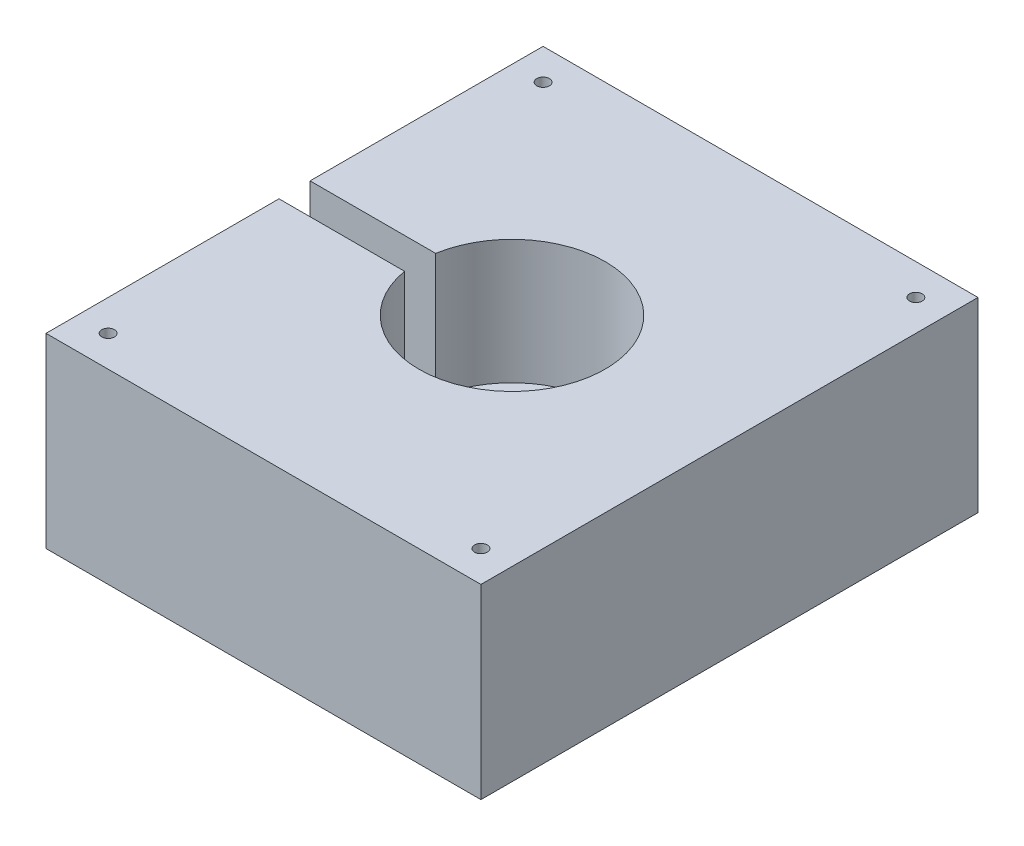
ISO-10303-21;
HEADER;
FILE_DESCRIPTION(('STEP AP214'),'2;1');
FILE_NAME('part.step','',(''),(''),'','','');
FILE_SCHEMA(('AUTOMOTIVE_DESIGN { 1 0 10303 214 1 1 1 1 }'));
ENDSEC;
DATA;
#1=APPLICATION_CONTEXT('core data for automotive mechanical design processes');
#2=APPLICATION_PROTOCOL_DEFINITION('international standard','automotive_design',2000,#1);
#3=PRODUCT_CONTEXT('',#1,'mechanical');
#4=PRODUCT('Part','Part','',(#3));
#5=PRODUCT_RELATED_PRODUCT_CATEGORY('part','',(#4));
#6=PRODUCT_DEFINITION_FORMATION('','',#4);
#7=PRODUCT_DEFINITION_CONTEXT('part definition',#1,'design');
#8=PRODUCT_DEFINITION('design','',#6,#7);
#9=PRODUCT_DEFINITION_SHAPE('','',#8);
#10=(LENGTH_UNIT() NAMED_UNIT(*) SI_UNIT(.MILLI.,.METRE.));
#11=(NAMED_UNIT(*) PLANE_ANGLE_UNIT() SI_UNIT($,.RADIAN.));
#12=(NAMED_UNIT(*) SI_UNIT($,.STERADIAN.) SOLID_ANGLE_UNIT());
#13=UNCERTAINTY_MEASURE_WITH_UNIT(LENGTH_MEASURE(1.E-05),#10,'distance_accuracy_value','');
#14=(GEOMETRIC_REPRESENTATION_CONTEXT(3) GLOBAL_UNCERTAINTY_ASSIGNED_CONTEXT((#13)) GLOBAL_UNIT_ASSIGNED_CONTEXT((#10,
#11,#12)) REPRESENTATION_CONTEXT('',''));
#15=CARTESIAN_POINT('',(0.,0.,0.));
#16=DIRECTION('',(0.,0.,1.));
#17=DIRECTION('',(1.,0.,0.));
#18=AXIS2_PLACEMENT_3D('',#15,#16,#17);
#19=CARTESIAN_POINT('',(88.9,76.2,101.6));
#20=DIRECTION('',(-1.,0.,0.));
#21=DIRECTION('',(0.,0.,1.));
#22=AXIS2_PLACEMENT_3D('',#19,#20,#21);
#23=PLANE('',#22);
#24=DIRECTION('',(0.,0.,-1.));
#25=VECTOR('',#24,1.);
#26=CARTESIAN_POINT('',(88.9,0.,101.6));
#27=LINE('',#26,#25);
#28=CARTESIAN_POINT('',(88.9,0.,101.6));
#29=VERTEX_POINT('',#28);
#30=CARTESIAN_POINT('',(88.9,0.,-101.6));
#31=VERTEX_POINT('',#30);
#32=EDGE_CURVE('E184',#29,#31,#27,.T.);
#33=ORIENTED_EDGE('',*,*,#32,.T.);
#34=DIRECTION('',(0.,-1.,0.));
#35=VECTOR('',#34,1.);
#36=CARTESIAN_POINT('',(88.9,76.2,-101.6));
#37=LINE('',#36,#35);
#38=CARTESIAN_POINT('',(88.9,76.2,-101.6));
#39=VERTEX_POINT('',#38);
#40=EDGE_CURVE('E11',#39,#31,#37,.T.);
#41=ORIENTED_EDGE('',*,*,#40,.F.);
#42=DIRECTION('',(0.,0.,-1.));
#43=VECTOR('',#42,1.);
#44=CARTESIAN_POINT('',(88.9,76.2,101.6));
#45=LINE('',#44,#43);
#46=CARTESIAN_POINT('',(88.9,76.2,101.6));
#47=VERTEX_POINT('',#46);
#48=EDGE_CURVE('E185',#47,#39,#45,.T.);
#49=ORIENTED_EDGE('',*,*,#48,.F.);
#50=DIRECTION('',(0.,-1.,0.));
#51=VECTOR('',#50,1.);
#52=CARTESIAN_POINT('',(88.9,76.2,101.6));
#53=LINE('',#52,#51);
#54=EDGE_CURVE('E192',#47,#29,#53,.T.);
#55=ORIENTED_EDGE('',*,*,#54,.T.);
#56=EDGE_LOOP('',(#33,#41,#49,#55));
#57=FACE_BOUND('',#56,.T.);
#58=ADVANCED_FACE('F41',(#57),#23,.F.);
#59=CARTESIAN_POINT('',(-88.9,76.2,-101.6));
#60=DIRECTION('',(0.,0.,1.));
#61=DIRECTION('',(1.,0.,0.));
#62=AXIS2_PLACEMENT_3D('',#59,#60,#61);
#63=PLANE('',#62);
#64=DIRECTION('',(-1.,0.,0.));
#65=VECTOR('',#64,1.);
#66=CARTESIAN_POINT('',(-88.9,0.,-101.6));
#67=LINE('',#66,#65);
#68=CARTESIAN_POINT('',(-88.9,0.,-101.6));
#69=VERTEX_POINT('',#68);
#70=EDGE_CURVE('E195',#31,#69,#67,.T.);
#71=ORIENTED_EDGE('',*,*,#70,.T.);
#72=DIRECTION('',(0.,-1.,0.));
#73=VECTOR('',#72,1.);
#74=CARTESIAN_POINT('',(-88.9,76.2,-101.6));
#75=LINE('',#74,#73);
#76=CARTESIAN_POINT('',(-88.9,76.2,-101.6));
#77=VERTEX_POINT('',#76);
#78=EDGE_CURVE('E48',#77,#69,#75,.T.);
#79=ORIENTED_EDGE('',*,*,#78,.F.);
#80=DIRECTION('',(-1.,0.,0.));
#81=VECTOR('',#80,1.);
#82=CARTESIAN_POINT('',(-88.9,76.2,-101.6));
#83=LINE('',#82,#81);
#84=EDGE_CURVE('E92',#39,#77,#83,.T.);
#85=ORIENTED_EDGE('',*,*,#84,.F.);
#86=ORIENTED_EDGE('',*,*,#40,.T.);
#87=EDGE_LOOP('',(#71,#79,#85,#86));
#88=FACE_BOUND('',#87,.T.);
#89=ADVANCED_FACE('F229',(#88),#63,.F.);
#90=CARTESIAN_POINT('',(-88.9,76.2,101.6));
#91=DIRECTION('',(1.,0.,0.));
#92=DIRECTION('',(0.,0.,-1.));
#93=AXIS2_PLACEMENT_3D('',#90,#91,#92);
#94=PLANE('',#93);
#95=DIRECTION('',(0.,0.,1.));
#96=VECTOR('',#95,1.);
#97=CARTESIAN_POINT('',(-88.9,25.4,0.));
#98=LINE('',#97,#96);
#99=CARTESIAN_POINT('',(-88.9,25.4,-6.35));
#100=VERTEX_POINT('',#99);
#101=CARTESIAN_POINT('',(-88.9,25.4,6.35));
#102=VERTEX_POINT('',#101);
#103=EDGE_CURVE('E137',#100,#102,#98,.T.);
#104=ORIENTED_EDGE('',*,*,#103,.F.);
#105=DIRECTION('',(0.,1.,0.));
#106=VECTOR('',#105,1.);
#107=CARTESIAN_POINT('',(-88.9,-122.706178129071,-6.35));
#108=LINE('',#107,#106);
#109=CARTESIAN_POINT('',(-88.9,76.2,-6.35));
#110=VERTEX_POINT('',#109);
#111=EDGE_CURVE('E126',#100,#110,#108,.T.);
#112=ORIENTED_EDGE('',*,*,#111,.T.);
#113=DIRECTION('',(0.,0.,1.));
#114=VECTOR('',#113,1.);
#115=CARTESIAN_POINT('',(-88.9,76.2,101.6));
#116=LINE('',#115,#114);
#117=EDGE_CURVE('E189',#77,#110,#116,.T.);
#118=ORIENTED_EDGE('',*,*,#117,.F.);
#119=ORIENTED_EDGE('',*,*,#78,.T.);
#120=DIRECTION('',(0.,0.,1.));
#121=VECTOR('',#120,1.);
#122=CARTESIAN_POINT('',(-88.9,0.,101.6));
#123=LINE('',#122,#121);
#124=CARTESIAN_POINT('',(-88.9,0.,101.6));
#125=VERTEX_POINT('',#124);
#126=EDGE_CURVE('E197',#69,#125,#123,.T.);
#127=ORIENTED_EDGE('',*,*,#126,.T.);
#128=DIRECTION('',(0.,-1.,0.));
#129=VECTOR('',#128,1.);
#130=CARTESIAN_POINT('',(-88.9,76.2,101.6));
#131=LINE('',#130,#129);
#132=CARTESIAN_POINT('',(-88.9,76.2,101.6));
#133=VERTEX_POINT('',#132);
#134=EDGE_CURVE('E201',#133,#125,#131,.T.);
#135=ORIENTED_EDGE('',*,*,#134,.F.);
#136=CARTESIAN_POINT('',(-88.9,76.2,6.35));
#137=VERTEX_POINT('',#136);
#138=EDGE_CURVE('E188',#137,#133,#116,.T.);
#139=ORIENTED_EDGE('',*,*,#138,.F.);
#140=DIRECTION('',(0.,1.,0.));
#141=VECTOR('',#140,1.);
#142=CARTESIAN_POINT('',(-88.9,-122.706178129071,6.35));
#143=LINE('',#142,#141);
#144=EDGE_CURVE('E149',#102,#137,#143,.T.);
#145=ORIENTED_EDGE('',*,*,#144,.F.);
#146=EDGE_LOOP('',(#104,#112,#118,#119,#127,#135,#139,#145));
#147=FACE_BOUND('',#146,.T.);
#148=ADVANCED_FACE('F147',(#147),#94,.F.);
#149=CARTESIAN_POINT('',(-88.9,76.2,101.6));
#150=DIRECTION('',(0.,0.,-1.));
#151=DIRECTION('',(-1.,0.,0.));
#152=AXIS2_PLACEMENT_3D('',#149,#150,#151);
#153=PLANE('',#152);
#154=DIRECTION('',(1.,0.,0.));
#155=VECTOR('',#154,1.);
#156=CARTESIAN_POINT('',(-88.9,0.,101.6));
#157=LINE('',#156,#155);
#158=EDGE_CURVE('E85',#125,#29,#157,.T.);
#159=ORIENTED_EDGE('',*,*,#158,.T.);
#160=ORIENTED_EDGE('',*,*,#54,.F.);
#161=DIRECTION('',(1.,0.,0.));
#162=VECTOR('',#161,1.);
#163=CARTESIAN_POINT('',(-88.9,76.2,101.6));
#164=LINE('',#163,#162);
#165=EDGE_CURVE('E64',#133,#47,#164,.T.);
#166=ORIENTED_EDGE('',*,*,#165,.F.);
#167=ORIENTED_EDGE('',*,*,#134,.T.);
#168=EDGE_LOOP('',(#159,#160,#166,#167));
#169=FACE_BOUND('',#168,.T.);
#170=ADVANCED_FACE('F211',(#169),#153,.F.);
#171=CARTESIAN_POINT('',(0.,76.2,0.));
#172=DIRECTION('',(0.,-1.,0.));
#173=DIRECTION('',(0.,0.,-1.));
#174=AXIS2_PLACEMENT_3D('',#171,#172,#173);
#175=PLANE('',#174);
#176=CARTESIAN_POINT('',(76.2,76.2,-88.9));
#177=DIRECTION('',(0.,1.,0.));
#178=DIRECTION('',(0.,0.,1.));
#179=AXIS2_PLACEMENT_3D('',#176,#177,#178);
#180=CIRCLE('',#179,2.5908);
#181=CARTESIAN_POINT('',(76.2,76.2,-86.3092));
#182=VERTEX_POINT('',#181);
#183=EDGE_CURVE('E160',#182,#182,#180,.T.);
#184=ORIENTED_EDGE('',*,*,#183,.F.);
#185=EDGE_LOOP('',(#184));
#186=FACE_BOUND('',#185,.T.);
#187=CARTESIAN_POINT('',(76.2,76.2,88.9));
#188=DIRECTION('',(0.,1.,0.));
#189=DIRECTION('',(0.,0.,1.));
#190=AXIS2_PLACEMENT_3D('',#187,#188,#189);
#191=CIRCLE('',#190,2.5908);
#192=CARTESIAN_POINT('',(76.2,76.2,91.4908));
#193=VERTEX_POINT('',#192);
#194=EDGE_CURVE('E166',#193,#193,#191,.T.);
#195=ORIENTED_EDGE('',*,*,#194,.F.);
#196=EDGE_LOOP('',(#195));
#197=FACE_BOUND('',#196,.T.);
#198=CARTESIAN_POINT('',(-76.2,76.2,88.9));
#199=DIRECTION('',(0.,1.,0.));
#200=DIRECTION('',(0.,0.,1.));
#201=AXIS2_PLACEMENT_3D('',#198,#199,#200);
#202=CIRCLE('',#201,2.5908);
#203=CARTESIAN_POINT('',(-76.2,76.2,91.4908));
#204=VERTEX_POINT('',#203);
#205=EDGE_CURVE('E172',#204,#204,#202,.T.);
#206=ORIENTED_EDGE('',*,*,#205,.F.);
#207=EDGE_LOOP('',(#206));
#208=FACE_BOUND('',#207,.T.);
#209=CARTESIAN_POINT('',(-76.2,76.2,-88.9));
#210=DIRECTION('',(0.,1.,0.));
#211=DIRECTION('',(0.,0.,1.));
#212=AXIS2_PLACEMENT_3D('',#209,#210,#211);
#213=CIRCLE('',#212,2.5908);
#214=CARTESIAN_POINT('',(-76.2,76.2,-86.3092));
#215=VERTEX_POINT('',#214);
#216=EDGE_CURVE('E178',#215,#215,#213,.T.);
#217=ORIENTED_EDGE('',*,*,#216,.F.);
#218=EDGE_LOOP('',(#217));
#219=FACE_BOUND('',#218,.T.);
#220=ORIENTED_EDGE('',*,*,#117,.T.);
#221=DIRECTION('',(-1.,0.,0.));
#222=VECTOR('',#221,1.);
#223=CARTESIAN_POINT('',(0.,76.2,-6.35));
#224=LINE('',#223,#222);
#225=CARTESIAN_POINT('',(-37.5671066226826,76.2,-6.35));
#226=VERTEX_POINT('',#225);
#227=EDGE_CURVE('E132',#226,#110,#224,.T.);
#228=ORIENTED_EDGE('',*,*,#227,.F.);
#229=CARTESIAN_POINT('',(0.,76.2,0.));
#230=DIRECTION('',(0.,1.,0.));
#231=DIRECTION('',(0.,0.,1.));
#232=AXIS2_PLACEMENT_3D('',#229,#230,#231);
#233=CIRCLE('',#232,38.1);
#234=CARTESIAN_POINT('',(-37.5671066226826,76.2,6.35));
#235=VERTEX_POINT('',#234);
#236=EDGE_CURVE('E215',#235,#226,#233,.T.);
#237=ORIENTED_EDGE('',*,*,#236,.F.);
#238=DIRECTION('',(-1.,0.,0.));
#239=VECTOR('',#238,1.);
#240=CARTESIAN_POINT('',(0.,76.2,6.35));
#241=LINE('',#240,#239);
#242=EDGE_CURVE('E55',#235,#137,#241,.T.);
#243=ORIENTED_EDGE('',*,*,#242,.T.);
#244=ORIENTED_EDGE('',*,*,#138,.T.);
#245=ORIENTED_EDGE('',*,*,#165,.T.);
#246=ORIENTED_EDGE('',*,*,#48,.T.);
#247=ORIENTED_EDGE('',*,*,#84,.T.);
#248=EDGE_LOOP('',(#220,#228,#237,#243,#244,#245,#246,#247));
#249=FACE_BOUND('',#248,.T.);
#250=ADVANCED_FACE('F212',(#186,#197,#208,#219,#249),#175,.F.);
#251=CARTESIAN_POINT('',(0.,0.,0.));
#252=DIRECTION('',(0.,-1.,0.));
#253=DIRECTION('',(0.,0.,-1.));
#254=AXIS2_PLACEMENT_3D('',#251,#252,#253);
#255=PLANE('',#254);
#256=ORIENTED_EDGE('',*,*,#32,.F.);
#257=ORIENTED_EDGE('',*,*,#158,.F.);
#258=ORIENTED_EDGE('',*,*,#126,.F.);
#259=ORIENTED_EDGE('',*,*,#70,.F.);
#260=EDGE_LOOP('',(#256,#257,#258,#259));
#261=FACE_BOUND('',#260,.T.);
#262=ADVANCED_FACE('F207',(#261),#255,.T.);
#263=CARTESIAN_POINT('',(-76.2,64.262,-88.9));
#264=DIRECTION('',(0.,1.,0.));
#265=DIRECTION('',(0.,0.,1.));
#266=AXIS2_PLACEMENT_3D('',#263,#264,#265);
#267=CONICAL_SURFACE('',#266,2.5908,1.02974425867666);
#268=CARTESIAN_POINT('',(-76.2,62.7052903082234,-88.9));
#269=VERTEX_POINT('',#268);
#270=VERTEX_LOOP('',#269);
#271=FACE_BOUND('',#270,.T.);
#272=CARTESIAN_POINT('',(-76.2,64.262,-88.9));
#273=DIRECTION('',(0.,1.,0.));
#274=DIRECTION('',(0.,0.,1.));
#275=AXIS2_PLACEMENT_3D('',#272,#273,#274);
#276=CIRCLE('',#275,2.5908);
#277=CARTESIAN_POINT('',(-76.2,64.262,-86.3092));
#278=VERTEX_POINT('',#277);
#279=EDGE_CURVE('E181',#278,#278,#276,.T.);
#280=ORIENTED_EDGE('',*,*,#279,.T.);
#281=EDGE_LOOP('',(#280));
#282=FACE_BOUND('',#281,.T.);
#283=ADVANCED_FACE('F242',(#271,#282),#267,.F.);
#284=CARTESIAN_POINT('',(-76.2,76.2,-88.9));
#285=DIRECTION('',(0.,1.,0.));
#286=DIRECTION('',(0.,0.,1.));
#287=AXIS2_PLACEMENT_3D('',#284,#285,#286);
#288=CYLINDRICAL_SURFACE('',#287,2.5908);
#289=ORIENTED_EDGE('',*,*,#279,.F.);
#290=EDGE_LOOP('',(#289));
#291=FACE_BOUND('',#290,.T.);
#292=ORIENTED_EDGE('',*,*,#216,.T.);
#293=EDGE_LOOP('',(#292));
#294=FACE_BOUND('',#293,.T.);
#295=ADVANCED_FACE('F248',(#291,#294),#288,.F.);
#296=CARTESIAN_POINT('',(-76.2,64.262,88.9));
#297=DIRECTION('',(0.,1.,0.));
#298=DIRECTION('',(0.,0.,1.));
#299=AXIS2_PLACEMENT_3D('',#296,#297,#298);
#300=CONICAL_SURFACE('',#299,2.5908,1.02974425867666);
#301=CARTESIAN_POINT('',(-76.2,62.7052903082234,88.9));
#302=VERTEX_POINT('',#301);
#303=VERTEX_LOOP('',#302);
#304=FACE_BOUND('',#303,.T.);
#305=CARTESIAN_POINT('',(-76.2,64.262,88.9));
#306=DIRECTION('',(0.,1.,0.));
#307=DIRECTION('',(0.,0.,1.));
#308=AXIS2_PLACEMENT_3D('',#305,#306,#307);
#309=CIRCLE('',#308,2.5908);
#310=CARTESIAN_POINT('',(-76.2,64.262,91.4908));
#311=VERTEX_POINT('',#310);
#312=EDGE_CURVE('E175',#311,#311,#309,.T.);
#313=ORIENTED_EDGE('',*,*,#312,.T.);
#314=EDGE_LOOP('',(#313));
#315=FACE_BOUND('',#314,.T.);
#316=ADVANCED_FACE('F252',(#304,#315),#300,.F.);
#317=CARTESIAN_POINT('',(-76.2,76.2,88.9));
#318=DIRECTION('',(0.,1.,0.));
#319=DIRECTION('',(0.,0.,1.));
#320=AXIS2_PLACEMENT_3D('',#317,#318,#319);
#321=CYLINDRICAL_SURFACE('',#320,2.5908);
#322=ORIENTED_EDGE('',*,*,#312,.F.);
#323=EDGE_LOOP('',(#322));
#324=FACE_BOUND('',#323,.T.);
#325=ORIENTED_EDGE('',*,*,#205,.T.);
#326=EDGE_LOOP('',(#325));
#327=FACE_BOUND('',#326,.T.);
#328=ADVANCED_FACE('F256',(#324,#327),#321,.F.);
#329=CARTESIAN_POINT('',(76.2,64.262,88.9));
#330=DIRECTION('',(0.,1.,0.));
#331=DIRECTION('',(0.,0.,1.));
#332=AXIS2_PLACEMENT_3D('',#329,#330,#331);
#333=CONICAL_SURFACE('',#332,2.5908,1.02974425867666);
#334=CARTESIAN_POINT('',(76.2,62.7052903082234,88.9));
#335=VERTEX_POINT('',#334);
#336=VERTEX_LOOP('',#335);
#337=FACE_BOUND('',#336,.T.);
#338=CARTESIAN_POINT('',(76.2,64.262,88.9));
#339=DIRECTION('',(0.,1.,0.));
#340=DIRECTION('',(0.,0.,1.));
#341=AXIS2_PLACEMENT_3D('',#338,#339,#340);
#342=CIRCLE('',#341,2.5908);
#343=CARTESIAN_POINT('',(76.2,64.262,91.4908));
#344=VERTEX_POINT('',#343);
#345=EDGE_CURVE('E169',#344,#344,#342,.T.);
#346=ORIENTED_EDGE('',*,*,#345,.T.);
#347=EDGE_LOOP('',(#346));
#348=FACE_BOUND('',#347,.T.);
#349=ADVANCED_FACE('F260',(#337,#348),#333,.F.);
#350=CARTESIAN_POINT('',(76.2,76.2,88.9));
#351=DIRECTION('',(0.,1.,0.));
#352=DIRECTION('',(0.,0.,1.));
#353=AXIS2_PLACEMENT_3D('',#350,#351,#352);
#354=CYLINDRICAL_SURFACE('',#353,2.5908);
#355=ORIENTED_EDGE('',*,*,#345,.F.);
#356=EDGE_LOOP('',(#355));
#357=FACE_BOUND('',#356,.T.);
#358=ORIENTED_EDGE('',*,*,#194,.T.);
#359=EDGE_LOOP('',(#358));
#360=FACE_BOUND('',#359,.T.);
#361=ADVANCED_FACE('F264',(#357,#360),#354,.F.);
#362=CARTESIAN_POINT('',(76.2,64.262,-88.9));
#363=DIRECTION('',(0.,1.,0.));
#364=DIRECTION('',(0.,0.,1.));
#365=AXIS2_PLACEMENT_3D('',#362,#363,#364);
#366=CONICAL_SURFACE('',#365,2.5908,1.02974425867666);
#367=CARTESIAN_POINT('',(76.2,62.7052903082234,-88.9));
#368=VERTEX_POINT('',#367);
#369=VERTEX_LOOP('',#368);
#370=FACE_BOUND('',#369,.T.);
#371=CARTESIAN_POINT('',(76.2,64.262,-88.9));
#372=DIRECTION('',(0.,1.,0.));
#373=DIRECTION('',(0.,0.,1.));
#374=AXIS2_PLACEMENT_3D('',#371,#372,#373);
#375=CIRCLE('',#374,2.5908);
#376=CARTESIAN_POINT('',(76.2,64.262,-86.3092));
#377=VERTEX_POINT('',#376);
#378=EDGE_CURVE('E163',#377,#377,#375,.T.);
#379=ORIENTED_EDGE('',*,*,#378,.T.);
#380=EDGE_LOOP('',(#379));
#381=FACE_BOUND('',#380,.T.);
#382=ADVANCED_FACE('F268',(#370,#381),#366,.F.);
#383=CARTESIAN_POINT('',(76.2,76.2,-88.9));
#384=DIRECTION('',(0.,1.,0.));
#385=DIRECTION('',(0.,0.,1.));
#386=AXIS2_PLACEMENT_3D('',#383,#384,#385);
#387=CYLINDRICAL_SURFACE('',#386,2.5908);
#388=ORIENTED_EDGE('',*,*,#378,.F.);
#389=EDGE_LOOP('',(#388));
#390=FACE_BOUND('',#389,.T.);
#391=ORIENTED_EDGE('',*,*,#183,.T.);
#392=EDGE_LOOP('',(#391));
#393=FACE_BOUND('',#392,.T.);
#394=ADVANCED_FACE('F272',(#390,#393),#387,.F.);
#395=CARTESIAN_POINT('',(0.,25.4,0.));
#396=DIRECTION('',(0.,-1.,0.));
#397=DIRECTION('',(0.,0.,-1.));
#398=AXIS2_PLACEMENT_3D('',#395,#396,#397);
#399=PLANE('',#398);
#400=CARTESIAN_POINT('',(0.,25.4,0.));
#401=DIRECTION('',(0.,-1.,0.));
#402=DIRECTION('',(0.,0.,-1.));
#403=AXIS2_PLACEMENT_3D('',#400,#401,#402);
#404=CIRCLE('',#403,38.1);
#405=CARTESIAN_POINT('',(-37.5671066226826,25.4,6.35));
#406=VERTEX_POINT('',#405);
#407=CARTESIAN_POINT('',(-37.5671066226826,25.4,-6.35));
#408=VERTEX_POINT('',#407);
#409=EDGE_CURVE('E144',#406,#408,#404,.F.);
#410=ORIENTED_EDGE('',*,*,#409,.T.);
#411=DIRECTION('',(-1.,0.,0.));
#412=VECTOR('',#411,1.);
#413=CARTESIAN_POINT('',(0.,25.4,-6.35));
#414=LINE('',#413,#412);
#415=EDGE_CURVE('E129',#408,#100,#414,.T.);
#416=ORIENTED_EDGE('',*,*,#415,.T.);
#417=ORIENTED_EDGE('',*,*,#103,.T.);
#418=DIRECTION('',(-1.,0.,0.));
#419=VECTOR('',#418,1.);
#420=CARTESIAN_POINT('',(0.,25.4,6.35));
#421=LINE('',#420,#419);
#422=EDGE_CURVE('E155',#406,#102,#421,.T.);
#423=ORIENTED_EDGE('',*,*,#422,.F.);
#424=EDGE_LOOP('',(#410,#416,#417,#423));
#425=FACE_BOUND('',#424,.T.);
#426=ADVANCED_FACE('F141',(#425),#399,.F.);
#427=CARTESIAN_POINT('',(0.,-122.706178129071,-6.35));
#428=DIRECTION('',(0.,0.,-1.));
#429=DIRECTION('',(-1.,0.,0.));
#430=AXIS2_PLACEMENT_3D('',#427,#428,#429);
#431=PLANE('',#430);
#432=DIRECTION('',(0.,1.,0.));
#433=VECTOR('',#432,1.);
#434=CARTESIAN_POINT('',(-37.5671066226826,-122.706178129071,-6.35));
#435=LINE('',#434,#433);
#436=EDGE_CURVE('E158',#408,#226,#435,.T.);
#437=ORIENTED_EDGE('',*,*,#436,.T.);
#438=ORIENTED_EDGE('',*,*,#227,.T.);
#439=ORIENTED_EDGE('',*,*,#111,.F.);
#440=ORIENTED_EDGE('',*,*,#415,.F.);
#441=EDGE_LOOP('',(#437,#438,#439,#440));
#442=FACE_BOUND('',#441,.T.);
#443=ADVANCED_FACE('F128',(#442),#431,.F.);
#444=CARTESIAN_POINT('',(0.,-122.706178129071,6.35));
#445=DIRECTION('',(0.,0.,-1.));
#446=DIRECTION('',(-1.,0.,0.));
#447=AXIS2_PLACEMENT_3D('',#444,#445,#446);
#448=PLANE('',#447);
#449=ORIENTED_EDGE('',*,*,#422,.T.);
#450=ORIENTED_EDGE('',*,*,#144,.T.);
#451=ORIENTED_EDGE('',*,*,#242,.F.);
#452=DIRECTION('',(0.,1.,0.));
#453=VECTOR('',#452,1.);
#454=CARTESIAN_POINT('',(-37.5671066226826,-122.706178129071,6.35));
#455=LINE('',#454,#453);
#456=EDGE_CURVE('E151',#406,#235,#455,.T.);
#457=ORIENTED_EDGE('',*,*,#456,.F.);
#458=EDGE_LOOP('',(#449,#450,#451,#457));
#459=FACE_BOUND('',#458,.T.);
#460=ADVANCED_FACE('F220',(#459),#448,.T.);
#461=CARTESIAN_POINT('',(0.,-122.706178129071,0.));
#462=DIRECTION('',(0.,1.,0.));
#463=DIRECTION('',(0.,0.,1.));
#464=AXIS2_PLACEMENT_3D('',#461,#462,#463);
#465=CYLINDRICAL_SURFACE('',#464,38.1);
#466=ORIENTED_EDGE('',*,*,#456,.T.);
#467=ORIENTED_EDGE('',*,*,#236,.T.);
#468=ORIENTED_EDGE('',*,*,#436,.F.);
#469=ORIENTED_EDGE('',*,*,#409,.F.);
#470=EDGE_LOOP('',(#466,#467,#468,#469));
#471=FACE_BOUND('',#470,.T.);
#472=ADVANCED_FACE('F221',(#471),#465,.F.);
#473=CLOSED_SHELL('',(#58,#89,#148,#170,#250,#262,#283,#295,#316,#328,#349,#361,#382,#394,#426,
#443,#460,#472));
#474=MANIFOLD_SOLID_BREP('B2',#473);
#475=ADVANCED_BREP_SHAPE_REPRESENTATION('',(#18,#474),#14);
#476=SHAPE_DEFINITION_REPRESENTATION(#9,#475);
ENDSEC;
END-ISO-10303-21;
